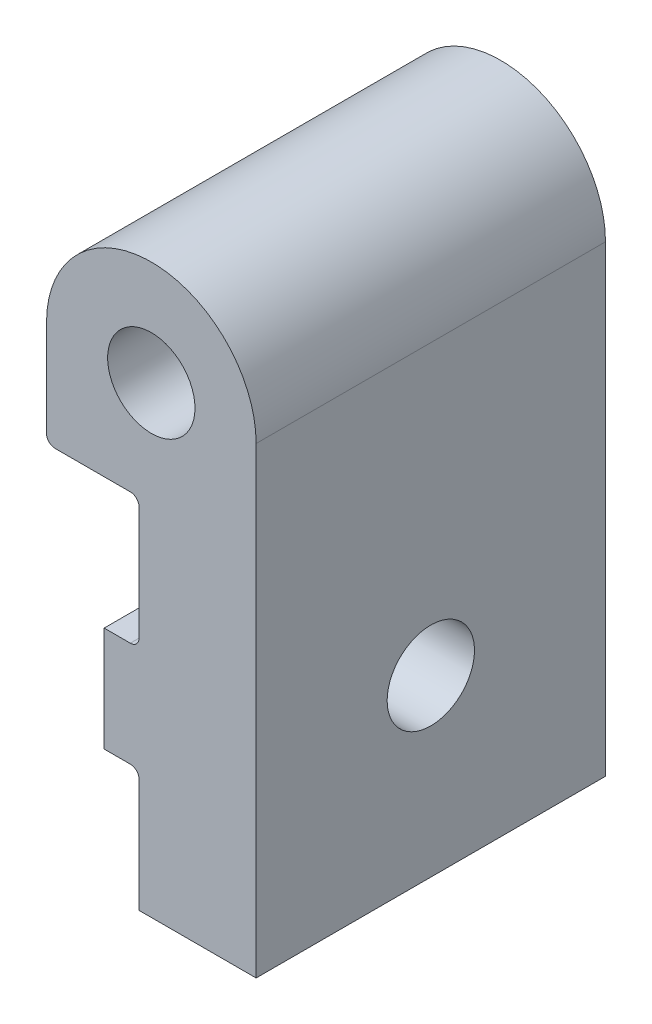
ISO-10303-21;
HEADER;
FILE_DESCRIPTION(('STEP AP214'),'2;1');
FILE_NAME('part.step','',(''),(''),'','','');
FILE_SCHEMA(('AUTOMOTIVE_DESIGN { 1 0 10303 214 1 1 1 1 }'));
ENDSEC;
DATA;
#1=APPLICATION_CONTEXT('core data for automotive mechanical design processes');
#2=APPLICATION_PROTOCOL_DEFINITION('international standard','automotive_design',2000,#1);
#3=PRODUCT_CONTEXT('',#1,'mechanical');
#4=PRODUCT('Part','Part','',(#3));
#5=PRODUCT_RELATED_PRODUCT_CATEGORY('part','',(#4));
#6=PRODUCT_DEFINITION_FORMATION('','',#4);
#7=PRODUCT_DEFINITION_CONTEXT('part definition',#1,'design');
#8=PRODUCT_DEFINITION('design','',#6,#7);
#9=PRODUCT_DEFINITION_SHAPE('','',#8);
#10=(LENGTH_UNIT() NAMED_UNIT(*) SI_UNIT(.MILLI.,.METRE.));
#11=(NAMED_UNIT(*) PLANE_ANGLE_UNIT() SI_UNIT($,.RADIAN.));
#12=(NAMED_UNIT(*) SI_UNIT($,.STERADIAN.) SOLID_ANGLE_UNIT());
#13=UNCERTAINTY_MEASURE_WITH_UNIT(LENGTH_MEASURE(1.E-05),#10,'distance_accuracy_value','');
#14=(GEOMETRIC_REPRESENTATION_CONTEXT(3) GLOBAL_UNCERTAINTY_ASSIGNED_CONTEXT((#13)) GLOBAL_UNIT_ASSIGNED_CONTEXT((#10,
#11,#12)) REPRESENTATION_CONTEXT('',''));
#15=CARTESIAN_POINT('',(0.,0.,0.));
#16=DIRECTION('',(0.,0.,1.));
#17=DIRECTION('',(1.,0.,0.));
#18=AXIS2_PLACEMENT_3D('',#15,#16,#17);
#19=CARTESIAN_POINT('',(6.29999999999991,-53.6,20.));
#20=DIRECTION('',(0.,-1.,0.));
#21=DIRECTION('',(0.,0.,-1.));
#22=AXIS2_PLACEMENT_3D('',#19,#20,#21);
#23=PLANE('',#22);
#24=DIRECTION('',(-1.,0.,0.));
#25=VECTOR('',#24,1.);
#26=CARTESIAN_POINT('',(8.29999999999991,-53.6,5.));
#27=LINE('',#26,#25);
#28=CARTESIAN_POINT('',(7.79999999999991,-53.6,5.));
#29=VERTEX_POINT('',#28);
#30=CARTESIAN_POINT('',(6.29999999999991,-53.6,5.));
#31=VERTEX_POINT('',#30);
#32=EDGE_CURVE('E184',#29,#31,#27,.T.);
#33=ORIENTED_EDGE('',*,*,#32,.F.);
#34=DIRECTION('',(0.,0.,-1.));
#35=VECTOR('',#34,1.);
#36=CARTESIAN_POINT('',(7.79999999999991,-53.6,0.));
#37=LINE('',#36,#35);
#38=CARTESIAN_POINT('',(7.79999999999991,-53.6,0.));
#39=VERTEX_POINT('',#38);
#40=EDGE_CURVE('E249',#29,#39,#37,.T.);
#41=ORIENTED_EDGE('',*,*,#40,.T.);
#42=DIRECTION('',(-1.,0.,0.));
#43=VECTOR('',#42,1.);
#44=CARTESIAN_POINT('',(6.29999999999991,-53.6,0.));
#45=LINE('',#44,#43);
#46=CARTESIAN_POINT('',(6.29999999999991,-53.6,0.));
#47=VERTEX_POINT('',#46);
#48=EDGE_CURVE('E271',#39,#47,#45,.T.);
#49=ORIENTED_EDGE('',*,*,#48,.T.);
#50=DIRECTION('',(0.,0.,-1.));
#51=VECTOR('',#50,1.);
#52=CARTESIAN_POINT('',(6.29999999999991,-53.6,20.));
#53=LINE('',#52,#51);
#54=EDGE_CURVE('E198',#31,#47,#53,.T.);
#55=ORIENTED_EDGE('',*,*,#54,.F.);
#56=EDGE_LOOP('',(#33,#41,#49,#55));
#57=FACE_BOUND('',#56,.T.);
#58=ADVANCED_FACE('F33',(#57),#23,.F.);
#59=CARTESIAN_POINT('',(6.29999999999991,-53.6,20.));
#60=DIRECTION('',(1.,0.,0.));
#61=DIRECTION('',(0.,0.,-1.));
#62=AXIS2_PLACEMENT_3D('',#59,#60,#61);
#63=PLANE('',#62);
#64=DIRECTION('',(0.,0.,-1.));
#65=VECTOR('',#64,1.);
#66=CARTESIAN_POINT('',(6.29999999999991,-59.6,20.));
#67=LINE('',#66,#65);
#68=CARTESIAN_POINT('',(6.29999999999991,-59.6,5.));
#69=VERTEX_POINT('',#68);
#70=CARTESIAN_POINT('',(6.29999999999991,-59.6,0.));
#71=VERTEX_POINT('',#70);
#72=EDGE_CURVE('E172',#69,#71,#67,.T.);
#73=ORIENTED_EDGE('',*,*,#72,.F.);
#74=DIRECTION('',(0.,-1.,0.));
#75=VECTOR('',#74,1.);
#76=CARTESIAN_POINT('',(6.29999999999991,-53.6,5.));
#77=LINE('',#76,#75);
#78=EDGE_CURVE('E182',#31,#69,#77,.T.);
#79=ORIENTED_EDGE('',*,*,#78,.F.);
#80=ORIENTED_EDGE('',*,*,#54,.T.);
#81=DIRECTION('',(0.,-1.,0.));
#82=VECTOR('',#81,1.);
#83=CARTESIAN_POINT('',(6.29999999999991,-53.6,0.));
#84=LINE('',#83,#82);
#85=EDGE_CURVE('E193',#47,#71,#84,.T.);
#86=ORIENTED_EDGE('',*,*,#85,.T.);
#87=EDGE_LOOP('',(#73,#79,#80,#86));
#88=FACE_BOUND('',#87,.T.);
#89=ADVANCED_FACE('F191',(#88),#63,.F.);
#90=CARTESIAN_POINT('',(7.29999999999991,-59.6,20.));
#91=DIRECTION('',(0.,1.,0.));
#92=DIRECTION('',(0.,0.,1.));
#93=AXIS2_PLACEMENT_3D('',#90,#91,#92);
#94=PLANE('',#93);
#95=DIRECTION('',(1.,0.,0.));
#96=VECTOR('',#95,1.);
#97=CARTESIAN_POINT('',(7.29999999999991,-59.6,0.));
#98=LINE('',#97,#96);
#99=CARTESIAN_POINT('',(7.79999999999991,-59.6,0.));
#100=VERTEX_POINT('',#99);
#101=EDGE_CURVE('E318',#71,#100,#98,.T.);
#102=ORIENTED_EDGE('',*,*,#101,.T.);
#103=DIRECTION('',(0.,0.,-1.));
#104=VECTOR('',#103,1.);
#105=CARTESIAN_POINT('',(7.79999999999991,-59.6,5.));
#106=LINE('',#105,#104);
#107=CARTESIAN_POINT('',(7.79999999999991,-59.6,5.));
#108=VERTEX_POINT('',#107);
#109=EDGE_CURVE('E175',#100,#108,#106,.F.);
#110=ORIENTED_EDGE('',*,*,#109,.T.);
#111=DIRECTION('',(-1.,0.,0.));
#112=VECTOR('',#111,1.);
#113=CARTESIAN_POINT('',(8.29999999999991,-59.6,5.));
#114=LINE('',#113,#112);
#115=EDGE_CURVE('E167',#108,#69,#114,.T.);
#116=ORIENTED_EDGE('',*,*,#115,.T.);
#117=ORIENTED_EDGE('',*,*,#72,.T.);
#118=EDGE_LOOP('',(#102,#110,#116,#117));
#119=FACE_BOUND('',#118,.T.);
#120=ADVANCED_FACE('F170',(#119),#94,.F.);
#121=CARTESIAN_POINT('',(26.2999999999999,-56.6,10.));
#122=DIRECTION('',(-1.,0.,0.));
#123=DIRECTION('',(0.,0.,1.));
#124=AXIS2_PLACEMENT_3D('',#121,#122,#123);
#125=CYLINDRICAL_SURFACE('',#124,2.5);
#126=CARTESIAN_POINT('',(15.,-56.6,10.));
#127=DIRECTION('',(-1.,0.,0.));
#128=DIRECTION('',(0.,0.,1.));
#129=AXIS2_PLACEMENT_3D('',#126,#127,#128);
#130=CIRCLE('',#129,2.5);
#131=CARTESIAN_POINT('',(15.,-56.6,12.5));
#132=VERTEX_POINT('',#131);
#133=EDGE_CURVE('E208',#132,#132,#130,.T.);
#134=ORIENTED_EDGE('',*,*,#133,.F.);
#135=EDGE_LOOP('',(#134));
#136=FACE_BOUND('',#135,.T.);
#137=CARTESIAN_POINT('',(8.29999999999991,-56.6,10.));
#138=DIRECTION('',(-1.,0.,0.));
#139=DIRECTION('',(0.,0.,1.));
#140=AXIS2_PLACEMENT_3D('',#137,#138,#139);
#141=CIRCLE('',#140,2.5);
#142=CARTESIAN_POINT('',(8.29999999999991,-56.6,12.5));
#143=VERTEX_POINT('',#142);
#144=EDGE_CURVE('E212',#143,#143,#141,.F.);
#145=ORIENTED_EDGE('',*,*,#144,.F.);
#146=EDGE_LOOP('',(#145));
#147=FACE_BOUND('',#146,.T.);
#148=ADVANCED_FACE('F425',(#136,#147),#125,.F.);
#149=CARTESIAN_POINT('',(9.,-40.1,20.));
#150=DIRECTION('',(0.,0.,1.));
#151=DIRECTION('',(1.,0.,0.));
#152=AXIS2_PLACEMENT_3D('',#149,#150,#151);
#153=PLANE('',#152);
#154=DIRECTION('',(0.,-1.,0.));
#155=VECTOR('',#154,1.);
#156=CARTESIAN_POINT('',(3.,-46.1,20.));
#157=LINE('',#156,#155);
#158=CARTESIAN_POINT('',(3.,-40.1,20.));
#159=VERTEX_POINT('',#158);
#160=CARTESIAN_POINT('',(3.,-45.6,20.));
#161=VERTEX_POINT('',#160);
#162=EDGE_CURVE('E309',#159,#161,#157,.T.);
#163=ORIENTED_EDGE('',*,*,#162,.T.);
#164=CARTESIAN_POINT('',(3.5,-45.6,20.));
#165=DIRECTION('',(0.,0.,1.));
#166=DIRECTION('',(1.,0.,0.));
#167=AXIS2_PLACEMENT_3D('',#164,#165,#166);
#168=CIRCLE('',#167,0.5);
#169=CARTESIAN_POINT('',(3.5,-46.1,20.));
#170=VERTEX_POINT('',#169);
#171=EDGE_CURVE('E226',#161,#170,#168,.T.);
#172=ORIENTED_EDGE('',*,*,#171,.T.);
#173=DIRECTION('',(1.,0.,0.));
#174=VECTOR('',#173,1.);
#175=CARTESIAN_POINT('',(8.29999999999991,-46.1,20.));
#176=LINE('',#175,#174);
#177=CARTESIAN_POINT('',(7.79999999999991,-46.1,20.));
#178=VERTEX_POINT('',#177);
#179=EDGE_CURVE('E312',#170,#178,#176,.T.);
#180=ORIENTED_EDGE('',*,*,#179,.T.);
#181=CARTESIAN_POINT('',(7.79999999999991,-46.6,20.));
#182=DIRECTION('',(0.,0.,1.));
#183=DIRECTION('',(1.,0.,0.));
#184=AXIS2_PLACEMENT_3D('',#181,#182,#183);
#185=CIRCLE('',#184,0.5);
#186=CARTESIAN_POINT('',(8.29999999999991,-46.6,20.));
#187=VERTEX_POINT('',#186);
#188=EDGE_CURVE('E230',#178,#187,#185,.F.);
#189=ORIENTED_EDGE('',*,*,#188,.T.);
#190=DIRECTION('',(0.,-1.,0.));
#191=VECTOR('',#190,1.);
#192=CARTESIAN_POINT('',(8.29999999999991,-53.6,20.));
#193=LINE('',#192,#191);
#194=CARTESIAN_POINT('',(8.29999999999991,-53.1,20.));
#195=VERTEX_POINT('',#194);
#196=EDGE_CURVE('E277',#187,#195,#193,.T.);
#197=ORIENTED_EDGE('',*,*,#196,.T.);
#198=CARTESIAN_POINT('',(7.79999999999991,-53.1,20.));
#199=DIRECTION('',(0.,0.,1.));
#200=DIRECTION('',(1.,0.,0.));
#201=AXIS2_PLACEMENT_3D('',#198,#199,#200);
#202=CIRCLE('',#201,0.5);
#203=CARTESIAN_POINT('',(7.79999999999991,-53.6,20.));
#204=VERTEX_POINT('',#203);
#205=EDGE_CURVE('E262',#195,#204,#202,.F.);
#206=ORIENTED_EDGE('',*,*,#205,.T.);
#207=DIRECTION('',(-1.,0.,0.));
#208=VECTOR('',#207,1.);
#209=CARTESIAN_POINT('',(7.29999999999991,-53.6,20.));
#210=LINE('',#209,#208);
#211=CARTESIAN_POINT('',(6.29999999999991,-53.6,20.));
#212=VERTEX_POINT('',#211);
#213=EDGE_CURVE('E294',#204,#212,#210,.T.);
#214=ORIENTED_EDGE('',*,*,#213,.T.);
#215=DIRECTION('',(0.,-1.,0.));
#216=VECTOR('',#215,1.);
#217=CARTESIAN_POINT('',(6.29999999999991,-53.6,20.));
#218=LINE('',#217,#216);
#219=CARTESIAN_POINT('',(6.29999999999991,-59.6,20.));
#220=VERTEX_POINT('',#219);
#221=EDGE_CURVE('E296',#212,#220,#218,.T.);
#222=ORIENTED_EDGE('',*,*,#221,.T.);
#223=DIRECTION('',(1.,0.,0.));
#224=VECTOR('',#223,1.);
#225=CARTESIAN_POINT('',(7.29999999999991,-59.6,20.));
#226=LINE('',#225,#224);
#227=CARTESIAN_POINT('',(7.79999999999991,-59.6,20.));
#228=VERTEX_POINT('',#227);
#229=EDGE_CURVE('E298',#220,#228,#226,.T.);
#230=ORIENTED_EDGE('',*,*,#229,.T.);
#231=CARTESIAN_POINT('',(7.79999999999991,-60.1,20.));
#232=DIRECTION('',(0.,0.,1.));
#233=DIRECTION('',(1.,0.,0.));
#234=AXIS2_PLACEMENT_3D('',#231,#232,#233);
#235=CIRCLE('',#234,0.5);
#236=CARTESIAN_POINT('',(8.29999999999991,-60.1,20.));
#237=VERTEX_POINT('',#236);
#238=EDGE_CURVE('E257',#228,#237,#235,.F.);
#239=ORIENTED_EDGE('',*,*,#238,.T.);
#240=DIRECTION('',(0.,-1.,0.));
#241=VECTOR('',#240,1.);
#242=CARTESIAN_POINT('',(8.29999999999991,-59.6,20.));
#243=LINE('',#242,#241);
#244=CARTESIAN_POINT('',(8.29999999999991,-66.6,20.));
#245=VERTEX_POINT('',#244);
#246=EDGE_CURVE('E301',#237,#245,#243,.T.);
#247=ORIENTED_EDGE('',*,*,#246,.T.);
#248=DIRECTION('',(1.,0.,0.));
#249=VECTOR('',#248,1.);
#250=CARTESIAN_POINT('',(15.,-66.6,20.));
#251=LINE('',#250,#249);
#252=CARTESIAN_POINT('',(15.,-66.6,20.));
#253=VERTEX_POINT('',#252);
#254=EDGE_CURVE('E303',#245,#253,#251,.T.);
#255=ORIENTED_EDGE('',*,*,#254,.T.);
#256=DIRECTION('',(0.,1.,0.));
#257=VECTOR('',#256,1.);
#258=CARTESIAN_POINT('',(15.,-40.1,20.));
#259=LINE('',#258,#257);
#260=CARTESIAN_POINT('',(15.,-40.1,20.));
#261=VERTEX_POINT('',#260);
#262=EDGE_CURVE('E305',#253,#261,#259,.T.);
#263=ORIENTED_EDGE('',*,*,#262,.T.);
#264=CARTESIAN_POINT('',(9.,-40.1,20.));
#265=DIRECTION('',(0.,0.,1.));
#266=DIRECTION('',(1.,0.,0.));
#267=AXIS2_PLACEMENT_3D('',#264,#265,#266);
#268=CIRCLE('',#267,6.);
#269=EDGE_CURVE('E307',#261,#159,#268,.T.);
#270=ORIENTED_EDGE('',*,*,#269,.T.);
#271=EDGE_LOOP('',(#163,#172,#180,#189,#197,#206,#214,#222,#230,#239,#247,#255,#263,#270));
#272=FACE_BOUND('',#271,.T.);
#273=CARTESIAN_POINT('',(9.,-40.1,20.));
#274=DIRECTION('',(0.,0.,1.));
#275=DIRECTION('',(1.,0.,0.));
#276=AXIS2_PLACEMENT_3D('',#273,#274,#275);
#277=CIRCLE('',#276,2.5);
#278=CARTESIAN_POINT('',(11.5,-40.1,20.));
#279=VERTEX_POINT('',#278);
#280=EDGE_CURVE('E287',#279,#279,#277,.T.);
#281=ORIENTED_EDGE('',*,*,#280,.F.);
#282=EDGE_LOOP('',(#281));
#283=FACE_BOUND('',#282,.T.);
#284=ADVANCED_FACE('F360',(#272,#283),#153,.T.);
#285=CARTESIAN_POINT('',(9.,-40.1,0.));
#286=DIRECTION('',(0.,0.,1.));
#287=DIRECTION('',(1.,0.,0.));
#288=AXIS2_PLACEMENT_3D('',#285,#286,#287);
#289=PLANE('',#288);
#290=DIRECTION('',(1.,0.,0.));
#291=VECTOR('',#290,1.);
#292=CARTESIAN_POINT('',(8.29999999999991,-46.1,0.));
#293=LINE('',#292,#291);
#294=CARTESIAN_POINT('',(3.5,-46.1,0.));
#295=VERTEX_POINT('',#294);
#296=CARTESIAN_POINT('',(7.79999999999991,-46.1,0.));
#297=VERTEX_POINT('',#296);
#298=EDGE_CURVE('E278',#295,#297,#293,.T.);
#299=ORIENTED_EDGE('',*,*,#298,.F.);
#300=CARTESIAN_POINT('',(3.5,-45.6,0.));
#301=DIRECTION('',(0.,0.,1.));
#302=DIRECTION('',(1.,0.,0.));
#303=AXIS2_PLACEMENT_3D('',#300,#301,#302);
#304=CIRCLE('',#303,0.5);
#305=CARTESIAN_POINT('',(3.,-45.6,0.));
#306=VERTEX_POINT('',#305);
#307=EDGE_CURVE('E222',#295,#306,#304,.F.);
#308=ORIENTED_EDGE('',*,*,#307,.T.);
#309=DIRECTION('',(0.,-1.,0.));
#310=VECTOR('',#309,1.);
#311=CARTESIAN_POINT('',(3.,-46.1,0.));
#312=LINE('',#311,#310);
#313=CARTESIAN_POINT('',(3.,-40.1,0.));
#314=VERTEX_POINT('',#313);
#315=EDGE_CURVE('E328',#314,#306,#312,.T.);
#316=ORIENTED_EDGE('',*,*,#315,.F.);
#317=CARTESIAN_POINT('',(9.,-40.1,0.));
#318=DIRECTION('',(0.,0.,1.));
#319=DIRECTION('',(1.,0.,0.));
#320=AXIS2_PLACEMENT_3D('',#317,#318,#319);
#321=CIRCLE('',#320,6.);
#322=CARTESIAN_POINT('',(15.,-40.1,0.));
#323=VERTEX_POINT('',#322);
#324=EDGE_CURVE('E326',#323,#314,#321,.T.);
#325=ORIENTED_EDGE('',*,*,#324,.F.);
#326=DIRECTION('',(0.,1.,0.));
#327=VECTOR('',#326,1.);
#328=CARTESIAN_POINT('',(15.,-40.1,0.));
#329=LINE('',#328,#327);
#330=CARTESIAN_POINT('',(15.,-66.6,0.));
#331=VERTEX_POINT('',#330);
#332=EDGE_CURVE('E324',#331,#323,#329,.T.);
#333=ORIENTED_EDGE('',*,*,#332,.F.);
#334=DIRECTION('',(1.,0.,0.));
#335=VECTOR('',#334,1.);
#336=CARTESIAN_POINT('',(15.,-66.6,0.));
#337=LINE('',#336,#335);
#338=CARTESIAN_POINT('',(8.29999999999991,-66.6,0.));
#339=VERTEX_POINT('',#338);
#340=EDGE_CURVE('E322',#339,#331,#337,.T.);
#341=ORIENTED_EDGE('',*,*,#340,.F.);
#342=DIRECTION('',(0.,-1.,0.));
#343=VECTOR('',#342,1.);
#344=CARTESIAN_POINT('',(8.29999999999991,-66.6,0.));
#345=LINE('',#344,#343);
#346=CARTESIAN_POINT('',(8.29999999999991,-60.1,0.));
#347=VERTEX_POINT('',#346);
#348=EDGE_CURVE('E320',#347,#339,#345,.T.);
#349=ORIENTED_EDGE('',*,*,#348,.F.);
#350=CARTESIAN_POINT('',(7.79999999999991,-60.1,0.));
#351=DIRECTION('',(0.,0.,1.));
#352=DIRECTION('',(1.,0.,0.));
#353=AXIS2_PLACEMENT_3D('',#350,#351,#352);
#354=CIRCLE('',#353,0.5);
#355=EDGE_CURVE('E251',#347,#100,#354,.T.);
#356=ORIENTED_EDGE('',*,*,#355,.T.);
#357=ORIENTED_EDGE('',*,*,#101,.F.);
#358=ORIENTED_EDGE('',*,*,#85,.F.);
#359=ORIENTED_EDGE('',*,*,#48,.F.);
#360=CARTESIAN_POINT('',(7.79999999999991,-53.1,0.));
#361=DIRECTION('',(0.,0.,1.));
#362=DIRECTION('',(1.,0.,0.));
#363=AXIS2_PLACEMENT_3D('',#360,#361,#362);
#364=CIRCLE('',#363,0.5);
#365=CARTESIAN_POINT('',(8.29999999999991,-53.1,0.));
#366=VERTEX_POINT('',#365);
#367=EDGE_CURVE('E41',#39,#366,#364,.T.);
#368=ORIENTED_EDGE('',*,*,#367,.T.);
#369=DIRECTION('',(0.,-1.,0.));
#370=VECTOR('',#369,1.);
#371=CARTESIAN_POINT('',(8.29999999999991,-53.1,0.));
#372=LINE('',#371,#370);
#373=CARTESIAN_POINT('',(8.29999999999991,-46.6,0.));
#374=VERTEX_POINT('',#373);
#375=EDGE_CURVE('E270',#374,#366,#372,.T.);
#376=ORIENTED_EDGE('',*,*,#375,.F.);
#377=CARTESIAN_POINT('',(7.79999999999991,-46.6,0.));
#378=DIRECTION('',(0.,0.,1.));
#379=DIRECTION('',(1.,0.,0.));
#380=AXIS2_PLACEMENT_3D('',#377,#378,#379);
#381=CIRCLE('',#380,0.5);
#382=EDGE_CURVE('E228',#374,#297,#381,.T.);
#383=ORIENTED_EDGE('',*,*,#382,.T.);
#384=EDGE_LOOP('',(#299,#308,#316,#325,#333,#341,#349,#356,#357,#358,#359,#368,#376,#383));
#385=FACE_BOUND('',#384,.T.);
#386=CARTESIAN_POINT('',(9.,-40.1,0.));
#387=DIRECTION('',(0.,0.,1.));
#388=DIRECTION('',(1.,0.,0.));
#389=AXIS2_PLACEMENT_3D('',#386,#387,#388);
#390=CIRCLE('',#389,2.5);
#391=CARTESIAN_POINT('',(11.5,-40.1,0.));
#392=VERTEX_POINT('',#391);
#393=EDGE_CURVE('E211',#392,#392,#390,.T.);
#394=ORIENTED_EDGE('',*,*,#393,.T.);
#395=EDGE_LOOP('',(#394));
#396=FACE_BOUND('',#395,.T.);
#397=ADVANCED_FACE('F268',(#385,#396),#289,.F.);
#398=ORIENTED_EDGE('',*,*,#213,.F.);
#399=DIRECTION('',(0.,0.,-1.));
#400=VECTOR('',#399,1.);
#401=CARTESIAN_POINT('',(7.79999999999991,-53.6,15.));
#402=LINE('',#401,#400);
#403=CARTESIAN_POINT('',(7.79999999999991,-53.6,15.));
#404=VERTEX_POINT('',#403);
#405=EDGE_CURVE('E246',#204,#404,#402,.T.);
#406=ORIENTED_EDGE('',*,*,#405,.T.);
#407=DIRECTION('',(-1.,0.,0.));
#408=VECTOR('',#407,1.);
#409=CARTESIAN_POINT('',(8.29999999999991,-53.6,15.));
#410=LINE('',#409,#408);
#411=CARTESIAN_POINT('',(6.29999999999991,-53.6,15.));
#412=VERTEX_POINT('',#411);
#413=EDGE_CURVE('E281',#404,#412,#410,.T.);
#414=ORIENTED_EDGE('',*,*,#413,.T.);
#415=EDGE_CURVE('E204',#212,#412,#53,.T.);
#416=ORIENTED_EDGE('',*,*,#415,.F.);
#417=EDGE_LOOP('',(#398,#406,#414,#416));
#418=FACE_BOUND('',#417,.T.);
#419=ADVANCED_FACE('F380',(#418),#23,.F.);
#420=ORIENTED_EDGE('',*,*,#415,.T.);
#421=DIRECTION('',(0.,1.,0.));
#422=VECTOR('',#421,1.);
#423=CARTESIAN_POINT('',(6.29999999999991,-53.6,15.));
#424=LINE('',#423,#422);
#425=CARTESIAN_POINT('',(6.29999999999991,-59.6,15.));
#426=VERTEX_POINT('',#425);
#427=EDGE_CURVE('E188',#426,#412,#424,.T.);
#428=ORIENTED_EDGE('',*,*,#427,.F.);
#429=EDGE_CURVE('E194',#220,#426,#67,.T.);
#430=ORIENTED_EDGE('',*,*,#429,.F.);
#431=ORIENTED_EDGE('',*,*,#221,.F.);
#432=EDGE_LOOP('',(#420,#428,#430,#431));
#433=FACE_BOUND('',#432,.T.);
#434=ADVANCED_FACE('F387',(#433),#63,.F.);
#435=DIRECTION('',(-1.,0.,0.));
#436=VECTOR('',#435,1.);
#437=CARTESIAN_POINT('',(8.29999999999991,-59.6,15.));
#438=LINE('',#437,#436);
#439=CARTESIAN_POINT('',(7.79999999999991,-59.6,15.));
#440=VERTEX_POINT('',#439);
#441=EDGE_CURVE('E178',#440,#426,#438,.T.);
#442=ORIENTED_EDGE('',*,*,#441,.F.);
#443=DIRECTION('',(0.,0.,-1.));
#444=VECTOR('',#443,1.);
#445=CARTESIAN_POINT('',(7.79999999999991,-59.6,20.));
#446=LINE('',#445,#444);
#447=EDGE_CURVE('E244',#440,#228,#446,.F.);
#448=ORIENTED_EDGE('',*,*,#447,.T.);
#449=ORIENTED_EDGE('',*,*,#229,.F.);
#450=ORIENTED_EDGE('',*,*,#429,.T.);
#451=EDGE_LOOP('',(#442,#448,#449,#450));
#452=FACE_BOUND('',#451,.T.);
#453=ADVANCED_FACE('F400',(#452),#94,.F.);
#454=CARTESIAN_POINT('',(15.,-66.6,20.));
#455=DIRECTION('',(0.,1.,0.));
#456=DIRECTION('',(0.,0.,1.));
#457=AXIS2_PLACEMENT_3D('',#454,#455,#456);
#458=PLANE('',#457);
#459=ORIENTED_EDGE('',*,*,#340,.T.);
#460=DIRECTION('',(0.,0.,-1.));
#461=VECTOR('',#460,1.);
#462=CARTESIAN_POINT('',(15.,-66.6,20.));
#463=LINE('',#462,#461);
#464=EDGE_CURVE('E200',#253,#331,#463,.T.);
#465=ORIENTED_EDGE('',*,*,#464,.F.);
#466=ORIENTED_EDGE('',*,*,#254,.F.);
#467=DIRECTION('',(0.,0.,-1.));
#468=VECTOR('',#467,1.);
#469=CARTESIAN_POINT('',(8.29999999999991,-66.6,20.));
#470=LINE('',#469,#468);
#471=EDGE_CURVE('E195',#245,#339,#470,.T.);
#472=ORIENTED_EDGE('',*,*,#471,.T.);
#473=EDGE_LOOP('',(#459,#465,#466,#472));
#474=FACE_BOUND('',#473,.T.);
#475=ADVANCED_FACE('F398',(#474),#458,.F.);
#476=CARTESIAN_POINT('',(15.,-40.1,20.));
#477=DIRECTION('',(-1.,0.,0.));
#478=DIRECTION('',(0.,0.,1.));
#479=AXIS2_PLACEMENT_3D('',#476,#477,#478);
#480=PLANE('',#479);
#481=ORIENTED_EDGE('',*,*,#133,.T.);
#482=EDGE_LOOP('',(#481));
#483=FACE_BOUND('',#482,.T.);
#484=ORIENTED_EDGE('',*,*,#332,.T.);
#485=DIRECTION('',(0.,0.,-1.));
#486=VECTOR('',#485,1.);
#487=CARTESIAN_POINT('',(15.,-40.1,20.));
#488=LINE('',#487,#486);
#489=EDGE_CURVE('E335',#261,#323,#488,.T.);
#490=ORIENTED_EDGE('',*,*,#489,.F.);
#491=ORIENTED_EDGE('',*,*,#262,.F.);
#492=ORIENTED_EDGE('',*,*,#464,.T.);
#493=EDGE_LOOP('',(#484,#490,#491,#492));
#494=FACE_BOUND('',#493,.T.);
#495=ADVANCED_FACE('F342',(#483,#494),#480,.F.);
#496=CARTESIAN_POINT('',(9.,-40.1,20.));
#497=DIRECTION('',(0.,0.,-1.));
#498=DIRECTION('',(-1.,0.,0.));
#499=AXIS2_PLACEMENT_3D('',#496,#497,#498);
#500=CYLINDRICAL_SURFACE('',#499,6.);
#501=ORIENTED_EDGE('',*,*,#324,.T.);
#502=DIRECTION('',(0.,0.,-1.));
#503=VECTOR('',#502,1.);
#504=CARTESIAN_POINT('',(3.,-40.1,20.));
#505=LINE('',#504,#503);
#506=EDGE_CURVE('E315',#159,#314,#505,.T.);
#507=ORIENTED_EDGE('',*,*,#506,.F.);
#508=ORIENTED_EDGE('',*,*,#269,.F.);
#509=ORIENTED_EDGE('',*,*,#489,.T.);
#510=EDGE_LOOP('',(#501,#507,#508,#509));
#511=FACE_BOUND('',#510,.T.);
#512=ADVANCED_FACE('F352',(#511),#500,.T.);
#513=CARTESIAN_POINT('',(3.,-46.1,20.));
#514=DIRECTION('',(1.,0.,0.));
#515=DIRECTION('',(0.,1.,0.));
#516=AXIS2_PLACEMENT_3D('',#513,#514,#515);
#517=PLANE('',#516);
#518=ORIENTED_EDGE('',*,*,#315,.T.);
#519=DIRECTION('',(0.,0.,-1.));
#520=VECTOR('',#519,1.);
#521=CARTESIAN_POINT('',(3.,-45.6,20.));
#522=LINE('',#521,#520);
#523=EDGE_CURVE('E224',#306,#161,#522,.F.);
#524=ORIENTED_EDGE('',*,*,#523,.T.);
#525=ORIENTED_EDGE('',*,*,#162,.F.);
#526=ORIENTED_EDGE('',*,*,#506,.T.);
#527=EDGE_LOOP('',(#518,#524,#525,#526));
#528=FACE_BOUND('',#527,.T.);
#529=ADVANCED_FACE('F356',(#528),#517,.F.);
#530=CARTESIAN_POINT('',(8.29999999999991,-46.1,20.));
#531=DIRECTION('',(0.,1.,0.));
#532=DIRECTION('',(0.,0.,1.));
#533=AXIS2_PLACEMENT_3D('',#530,#531,#532);
#534=PLANE('',#533);
#535=ORIENTED_EDGE('',*,*,#298,.T.);
#536=DIRECTION('',(0.,0.,-1.));
#537=VECTOR('',#536,1.);
#538=CARTESIAN_POINT('',(7.79999999999991,-46.1,20.));
#539=LINE('',#538,#537);
#540=EDGE_CURVE('E220',#297,#178,#539,.F.);
#541=ORIENTED_EDGE('',*,*,#540,.T.);
#542=ORIENTED_EDGE('',*,*,#179,.F.);
#543=DIRECTION('',(0.,0.,-1.));
#544=VECTOR('',#543,1.);
#545=CARTESIAN_POINT('',(3.5,-46.1,20.));
#546=LINE('',#545,#544);
#547=EDGE_CURVE('E217',#170,#295,#546,.T.);
#548=ORIENTED_EDGE('',*,*,#547,.T.);
#549=EDGE_LOOP('',(#535,#541,#542,#548));
#550=FACE_BOUND('',#549,.T.);
#551=ADVANCED_FACE('F367',(#550),#534,.F.);
#552=CARTESIAN_POINT('',(8.29999999999991,-53.1,20.));
#553=DIRECTION('',(1.,0.,0.));
#554=DIRECTION('',(0.,0.,-1.));
#555=AXIS2_PLACEMENT_3D('',#552,#553,#554);
#556=PLANE('',#555);
#557=DIRECTION('',(0.,-1.,0.));
#558=VECTOR('',#557,1.);
#559=CARTESIAN_POINT('',(8.29999999999991,-53.6,5.));
#560=LINE('',#559,#558);
#561=CARTESIAN_POINT('',(8.29999999999991,-53.1,5.));
#562=VERTEX_POINT('',#561);
#563=CARTESIAN_POINT('',(8.29999999999991,-60.1,5.));
#564=VERTEX_POINT('',#563);
#565=EDGE_CURVE('E627',#562,#564,#560,.T.);
#566=ORIENTED_EDGE('',*,*,#565,.T.);
#567=DIRECTION('',(0.,0.,-1.));
#568=VECTOR('',#567,1.);
#569=CARTESIAN_POINT('',(8.29999999999991,-60.1,0.));
#570=LINE('',#569,#568);
#571=EDGE_CURVE('E240',#564,#347,#570,.T.);
#572=ORIENTED_EDGE('',*,*,#571,.T.);
#573=ORIENTED_EDGE('',*,*,#348,.T.);
#574=ORIENTED_EDGE('',*,*,#471,.F.);
#575=ORIENTED_EDGE('',*,*,#246,.F.);
#576=DIRECTION('',(0.,0.,-1.));
#577=VECTOR('',#576,1.);
#578=CARTESIAN_POINT('',(8.29999999999991,-60.1,15.));
#579=LINE('',#578,#577);
#580=CARTESIAN_POINT('',(8.29999999999991,-60.1,15.));
#581=VERTEX_POINT('',#580);
#582=EDGE_CURVE('E237',#237,#581,#579,.T.);
#583=ORIENTED_EDGE('',*,*,#582,.T.);
#584=DIRECTION('',(0.,1.,0.));
#585=VECTOR('',#584,1.);
#586=CARTESIAN_POINT('',(8.29999999999991,-53.6,15.));
#587=LINE('',#586,#585);
#588=CARTESIAN_POINT('',(8.29999999999991,-53.1,15.));
#589=VERTEX_POINT('',#588);
#590=EDGE_CURVE('E179',#581,#589,#587,.T.);
#591=ORIENTED_EDGE('',*,*,#590,.T.);
#592=DIRECTION('',(0.,0.,-1.));
#593=VECTOR('',#592,1.);
#594=CARTESIAN_POINT('',(8.29999999999991,-53.1,20.));
#595=LINE('',#594,#593);
#596=EDGE_CURVE('E235',#589,#195,#595,.F.);
#597=ORIENTED_EDGE('',*,*,#596,.T.);
#598=ORIENTED_EDGE('',*,*,#196,.F.);
#599=DIRECTION('',(0.,0.,-1.));
#600=VECTOR('',#599,1.);
#601=CARTESIAN_POINT('',(8.29999999999991,-46.6,0.));
#602=LINE('',#601,#600);
#603=EDGE_CURVE('E207',#187,#374,#602,.T.);
#604=ORIENTED_EDGE('',*,*,#603,.T.);
#605=ORIENTED_EDGE('',*,*,#375,.T.);
#606=DIRECTION('',(0.,0.,-1.));
#607=VECTOR('',#606,1.);
#608=CARTESIAN_POINT('',(8.29999999999991,-53.1,5.));
#609=LINE('',#608,#607);
#610=EDGE_CURVE('E232',#366,#562,#609,.F.);
#611=ORIENTED_EDGE('',*,*,#610,.T.);
#612=EDGE_LOOP('',(#566,#572,#573,#574,#575,#583,#591,#597,#598,#604,#605,#611));
#613=FACE_BOUND('',#612,.T.);
#614=ORIENTED_EDGE('',*,*,#144,.T.);
#615=EDGE_LOOP('',(#614));
#616=FACE_BOUND('',#615,.T.);
#617=ADVANCED_FACE('F273',(#613,#616),#556,.F.);
#618=CARTESIAN_POINT('',(9.,-40.1,20.));
#619=DIRECTION('',(0.,0.,-1.));
#620=DIRECTION('',(-1.,0.,0.));
#621=AXIS2_PLACEMENT_3D('',#618,#619,#620);
#622=CYLINDRICAL_SURFACE('',#621,2.5);
#623=ORIENTED_EDGE('',*,*,#280,.T.);
#624=EDGE_LOOP('',(#623));
#625=FACE_BOUND('',#624,.T.);
#626=ORIENTED_EDGE('',*,*,#393,.F.);
#627=EDGE_LOOP('',(#626));
#628=FACE_BOUND('',#627,.T.);
#629=ADVANCED_FACE('F431',(#625,#628),#622,.F.);
#630=CARTESIAN_POINT('',(8.29999999999991,-53.6,5.));
#631=DIRECTION('',(0.,0.,-1.));
#632=DIRECTION('',(0.,1.,0.));
#633=AXIS2_PLACEMENT_3D('',#630,#631,#632);
#634=PLANE('',#633);
#635=ORIENTED_EDGE('',*,*,#78,.T.);
#636=ORIENTED_EDGE('',*,*,#115,.F.);
#637=CARTESIAN_POINT('',(7.79999999999991,-60.1,5.));
#638=DIRECTION('',(0.,0.,-1.));
#639=DIRECTION('',(0.,1.,0.));
#640=AXIS2_PLACEMENT_3D('',#637,#638,#639);
#641=CIRCLE('',#640,0.5);
#642=EDGE_CURVE('E253',#108,#564,#641,.T.);
#643=ORIENTED_EDGE('',*,*,#642,.T.);
#644=ORIENTED_EDGE('',*,*,#565,.F.);
#645=CARTESIAN_POINT('',(7.79999999999991,-53.1,5.));
#646=DIRECTION('',(0.,0.,-1.));
#647=DIRECTION('',(0.,1.,0.));
#648=AXIS2_PLACEMENT_3D('',#645,#646,#647);
#649=CIRCLE('',#648,0.5);
#650=EDGE_CURVE('E11',#562,#29,#649,.T.);
#651=ORIENTED_EDGE('',*,*,#650,.T.);
#652=ORIENTED_EDGE('',*,*,#32,.T.);
#653=EDGE_LOOP('',(#635,#636,#643,#644,#651,#652));
#654=FACE_BOUND('',#653,.T.);
#655=ADVANCED_FACE('F183',(#654),#634,.F.);
#656=CARTESIAN_POINT('',(8.29999999999991,-53.6,15.));
#657=DIRECTION('',(0.,0.,1.));
#658=DIRECTION('',(1.,0.,0.));
#659=AXIS2_PLACEMENT_3D('',#656,#657,#658);
#660=PLANE('',#659);
#661=ORIENTED_EDGE('',*,*,#427,.T.);
#662=ORIENTED_EDGE('',*,*,#413,.F.);
#663=CARTESIAN_POINT('',(7.79999999999991,-53.1,15.));
#664=DIRECTION('',(0.,0.,1.));
#665=DIRECTION('',(1.,0.,0.));
#666=AXIS2_PLACEMENT_3D('',#663,#664,#665);
#667=CIRCLE('',#666,0.5);
#668=EDGE_CURVE('E259',#404,#589,#667,.T.);
#669=ORIENTED_EDGE('',*,*,#668,.T.);
#670=ORIENTED_EDGE('',*,*,#590,.F.);
#671=CARTESIAN_POINT('',(7.79999999999991,-60.1,15.));
#672=DIRECTION('',(0.,0.,1.));
#673=DIRECTION('',(1.,0.,0.));
#674=AXIS2_PLACEMENT_3D('',#671,#672,#673);
#675=CIRCLE('',#674,0.5);
#676=EDGE_CURVE('E255',#581,#440,#675,.T.);
#677=ORIENTED_EDGE('',*,*,#676,.T.);
#678=ORIENTED_EDGE('',*,*,#441,.T.);
#679=EDGE_LOOP('',(#661,#662,#669,#670,#677,#678));
#680=FACE_BOUND('',#679,.T.);
#681=ADVANCED_FACE('F468',(#680),#660,.F.);
#682=CARTESIAN_POINT('',(7.79999999999991,-46.6,20.));
#683=DIRECTION('',(0.,0.,1.));
#684=DIRECTION('',(1.,0.,0.));
#685=AXIS2_PLACEMENT_3D('',#682,#683,#684);
#686=CYLINDRICAL_SURFACE('',#685,0.5);
#687=ORIENTED_EDGE('',*,*,#188,.F.);
#688=ORIENTED_EDGE('',*,*,#540,.F.);
#689=ORIENTED_EDGE('',*,*,#382,.F.);
#690=ORIENTED_EDGE('',*,*,#603,.F.);
#691=EDGE_LOOP('',(#687,#688,#689,#690));
#692=FACE_BOUND('',#691,.T.);
#693=ADVANCED_FACE('F371',(#692),#686,.F.);
#694=CARTESIAN_POINT('',(3.5,-45.6,20.));
#695=DIRECTION('',(0.,0.,-1.));
#696=DIRECTION('',(-1.,0.,0.));
#697=AXIS2_PLACEMENT_3D('',#694,#695,#696);
#698=CYLINDRICAL_SURFACE('',#697,0.5);
#699=ORIENTED_EDGE('',*,*,#171,.F.);
#700=ORIENTED_EDGE('',*,*,#523,.F.);
#701=ORIENTED_EDGE('',*,*,#307,.F.);
#702=ORIENTED_EDGE('',*,*,#547,.F.);
#703=EDGE_LOOP('',(#699,#700,#701,#702));
#704=FACE_BOUND('',#703,.T.);
#705=ADVANCED_FACE('F365',(#704),#698,.T.);
#706=CARTESIAN_POINT('',(7.79999999999991,-60.1,20.));
#707=DIRECTION('',(0.,0.,1.));
#708=DIRECTION('',(1.,0.,0.));
#709=AXIS2_PLACEMENT_3D('',#706,#707,#708);
#710=CYLINDRICAL_SURFACE('',#709,0.5);
#711=ORIENTED_EDGE('',*,*,#642,.F.);
#712=ORIENTED_EDGE('',*,*,#109,.F.);
#713=ORIENTED_EDGE('',*,*,#355,.F.);
#714=ORIENTED_EDGE('',*,*,#571,.F.);
#715=EDGE_LOOP('',(#711,#712,#713,#714));
#716=FACE_BOUND('',#715,.T.);
#717=ADVANCED_FACE('F487',(#716),#710,.F.);
#718=CARTESIAN_POINT('',(7.79999999999991,-60.1,20.));
#719=DIRECTION('',(0.,0.,1.));
#720=DIRECTION('',(1.,0.,0.));
#721=AXIS2_PLACEMENT_3D('',#718,#719,#720);
#722=CYLINDRICAL_SURFACE('',#721,0.5);
#723=ORIENTED_EDGE('',*,*,#238,.F.);
#724=ORIENTED_EDGE('',*,*,#447,.F.);
#725=ORIENTED_EDGE('',*,*,#676,.F.);
#726=ORIENTED_EDGE('',*,*,#582,.F.);
#727=EDGE_LOOP('',(#723,#724,#725,#726));
#728=FACE_BOUND('',#727,.T.);
#729=ADVANCED_FACE('F395',(#728),#722,.F.);
#730=CARTESIAN_POINT('',(7.79999999999991,-53.1,20.));
#731=DIRECTION('',(0.,0.,1.));
#732=DIRECTION('',(1.,0.,0.));
#733=AXIS2_PLACEMENT_3D('',#730,#731,#732);
#734=CYLINDRICAL_SURFACE('',#733,0.5);
#735=ORIENTED_EDGE('',*,*,#205,.F.);
#736=ORIENTED_EDGE('',*,*,#596,.F.);
#737=ORIENTED_EDGE('',*,*,#668,.F.);
#738=ORIENTED_EDGE('',*,*,#405,.F.);
#739=EDGE_LOOP('',(#735,#736,#737,#738));
#740=FACE_BOUND('',#739,.T.);
#741=ADVANCED_FACE('F375',(#740),#734,.F.);
#742=CARTESIAN_POINT('',(7.79999999999991,-53.1,20.));
#743=DIRECTION('',(0.,0.,1.));
#744=DIRECTION('',(1.,0.,0.));
#745=AXIS2_PLACEMENT_3D('',#742,#743,#744);
#746=CYLINDRICAL_SURFACE('',#745,0.5);
#747=ORIENTED_EDGE('',*,*,#650,.F.);
#748=ORIENTED_EDGE('',*,*,#610,.F.);
#749=ORIENTED_EDGE('',*,*,#367,.F.);
#750=ORIENTED_EDGE('',*,*,#40,.F.);
#751=EDGE_LOOP('',(#747,#748,#749,#750));
#752=FACE_BOUND('',#751,.T.);
#753=ADVANCED_FACE('F35',(#752),#746,.F.);
#754=CLOSED_SHELL('',(#58,#89,#120,#148,#284,#397,#419,#434,#453,#475,#495,#512,#529,#551,#617,
#629,#655,#681,#693,#705,#717,#729,#741,#753));
#755=MANIFOLD_SOLID_BREP('B2',#754);
#756=ADVANCED_BREP_SHAPE_REPRESENTATION('',(#18,#755),#14);
#757=SHAPE_DEFINITION_REPRESENTATION(#9,#756);
ENDSEC;
END-ISO-10303-21;
